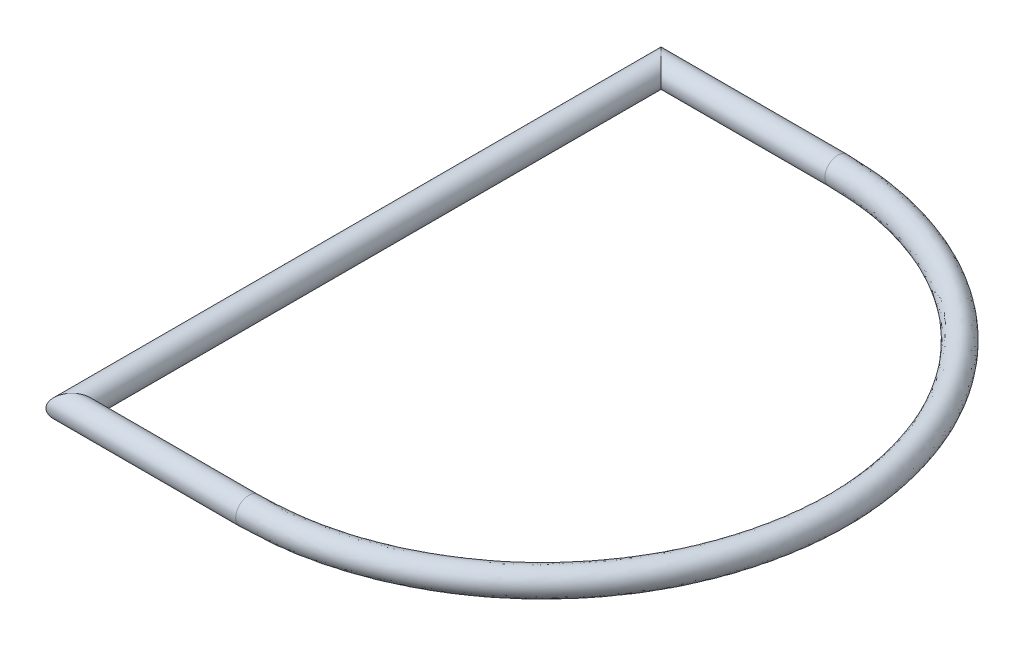
ISO-10303-21;
HEADER;
FILE_DESCRIPTION(('STEP AP214'),'2;1');
FILE_NAME('part.step','',(''),(''),'','','');
FILE_SCHEMA(('AUTOMOTIVE_DESIGN { 1 0 10303 214 1 1 1 1 }'));
ENDSEC;
DATA;
#1=APPLICATION_CONTEXT('core data for automotive mechanical design processes');
#2=APPLICATION_PROTOCOL_DEFINITION('international standard','automotive_design',2000,#1);
#3=PRODUCT_CONTEXT('',#1,'mechanical');
#4=PRODUCT('Part','Part','',(#3));
#5=PRODUCT_RELATED_PRODUCT_CATEGORY('part','',(#4));
#6=PRODUCT_DEFINITION_FORMATION('','',#4);
#7=PRODUCT_DEFINITION_CONTEXT('part definition',#1,'design');
#8=PRODUCT_DEFINITION('design','',#6,#7);
#9=PRODUCT_DEFINITION_SHAPE('','',#8);
#10=(LENGTH_UNIT() NAMED_UNIT(*) SI_UNIT(.MILLI.,.METRE.));
#11=(NAMED_UNIT(*) PLANE_ANGLE_UNIT() SI_UNIT($,.RADIAN.));
#12=(NAMED_UNIT(*) SI_UNIT($,.STERADIAN.) SOLID_ANGLE_UNIT());
#13=UNCERTAINTY_MEASURE_WITH_UNIT(LENGTH_MEASURE(1.E-05),#10,'distance_accuracy_value','');
#14=(GEOMETRIC_REPRESENTATION_CONTEXT(3) GLOBAL_UNCERTAINTY_ASSIGNED_CONTEXT((#13)) GLOBAL_UNIT_ASSIGNED_CONTEXT((#10,
#11,#12)) REPRESENTATION_CONTEXT('',''));
#15=CARTESIAN_POINT('',(0.,0.,0.));
#16=DIRECTION('',(0.,0.,1.));
#17=DIRECTION('',(1.,0.,0.));
#18=AXIS2_PLACEMENT_3D('',#15,#16,#17);
#19=CARTESIAN_POINT('',(0.,0.,-13.0517427730953));
#20=CARTESIAN_POINT('',(0.579660819813724,0.,-13.0296161322367));
#21=CARTESIAN_POINT('',(1.8142200585183,0.,-12.9824909032065));
#22=CARTESIAN_POINT('',(3.75106764393843,0.,-12.5553704856439));
#23=CARTESIAN_POINT('',(5.8291454221124,0.,-11.7581310971385));
#24=CARTESIAN_POINT('',(7.79275026697985,0.,-10.5571059298187));
#25=CARTESIAN_POINT('',(9.53264609347826,0.,-9.0047109175893));
#26=CARTESIAN_POINT('',(10.9815373041297,0.,-7.18821796835268));
#27=CARTESIAN_POINT('',(12.1344228285057,0.,-5.01672025087689));
#28=CARTESIAN_POINT('',(12.8717880115216,0.,-2.58416208948237));
#29=CARTESIAN_POINT('',(13.1425535713877,0.,0.));
#30=CARTESIAN_POINT('',(12.8717880115216,0.,2.5841620894824));
#31=CARTESIAN_POINT('',(12.1344228285057,0.,5.01672025087689));
#32=CARTESIAN_POINT('',(10.9815373041297,0.,7.18821796835269));
#33=CARTESIAN_POINT('',(9.53264609347826,0.,9.00471091758929));
#34=CARTESIAN_POINT('',(7.79275026697981,0.,10.5571059298188));
#35=CARTESIAN_POINT('',(5.8291454221124,0.,11.7581310971385));
#36=CARTESIAN_POINT('',(3.75106764393843,0.,12.5553704856439));
#37=CARTESIAN_POINT('',(1.81422005851829,0.,12.9824909032065));
#38=CARTESIAN_POINT('',(0.57966081981372,0.,13.0296161322367));
#39=CARTESIAN_POINT('',(0.,0.,13.0517427730953));
#40=CARTESIAN_POINT('',(0.,1.10348554619066,-13.0517427730953));
#41=CARTESIAN_POINT('',(0.579660819813724,1.10348554619066,-13.0296161322367));
#42=CARTESIAN_POINT('',(1.8142200585183,1.10348554619066,-12.9824909032065));
#43=CARTESIAN_POINT('',(3.75106764393843,1.10348554619066,-12.5553704856439));
#44=CARTESIAN_POINT('',(5.8291454221124,1.10348554619066,-11.7581310971385));
#45=CARTESIAN_POINT('',(7.79275026697985,1.10348554619066,-10.5571059298187));
#46=CARTESIAN_POINT('',(9.53264609347826,1.10348554619066,-9.0047109175893));
#47=CARTESIAN_POINT('',(10.9815373041297,1.10348554619066,-7.18821796835268));
#48=CARTESIAN_POINT('',(12.1344228285057,1.10348554619066,-5.01672025087689));
#49=CARTESIAN_POINT('',(12.8717880115216,1.10348554619066,-2.58416208948237));
#50=CARTESIAN_POINT('',(13.1425535713877,1.10348554619066,0.));
#51=CARTESIAN_POINT('',(12.8717880115216,1.10348554619066,2.5841620894824));
#52=CARTESIAN_POINT('',(12.1344228285057,1.10348554619066,5.01672025087689));
#53=CARTESIAN_POINT('',(10.9815373041297,1.10348554619066,7.18821796835269));
#54=CARTESIAN_POINT('',(9.53264609347825,1.10348554619066,9.0047109175893));
#55=CARTESIAN_POINT('',(7.79275026697981,1.10348554619066,10.5571059298188));
#56=CARTESIAN_POINT('',(5.8291454221124,1.10348554619066,11.7581310971385));
#57=CARTESIAN_POINT('',(3.75106764393843,1.10348554619066,12.5553704856439));
#58=CARTESIAN_POINT('',(1.81422005851829,1.10348554619066,12.9824909032065));
#59=CARTESIAN_POINT('',(0.57966081981372,1.10348554619066,13.0296161322367));
#60=CARTESIAN_POINT('',(0.,1.10348554619066,13.0517427730953));
#61=CARTESIAN_POINT('',(0.,1.10348554619066,-11.9482572269047));
#62=CARTESIAN_POINT('',(0.53069960438273,1.10348554619066,-11.9280300585203));
#63=CARTESIAN_POINT('',(1.66098144709569,1.10348554619066,-11.8849503181822));
#64=CARTESIAN_POINT('',(3.43385639334133,1.10348554619066,-11.4938164579652));
#65=CARTESIAN_POINT('',(5.33642993741903,1.10348554619066,-10.7640562698605));
#66=CARTESIAN_POINT('',(7.1342158004503,1.10348554619066,-9.66418471073763));
#67=CARTESIAN_POINT('',(8.72547558777085,1.10348554619066,-8.24458503304859));
#68=CARTESIAN_POINT('',(10.0548596057948,1.10348554619066,-6.57736113181003));
#69=CARTESIAN_POINT('',(11.1059529028818,1.10348554619066,-4.59821895149239));
#70=CARTESIAN_POINT('',(11.7840714752216,1.10348554619066,-2.36194905499699));
#71=CARTESIAN_POINT('',(12.031110489848,1.10348554619066,0.));
#72=CARTESIAN_POINT('',(11.7840714752216,1.10348554619066,2.36194905499697));
#73=CARTESIAN_POINT('',(11.1059529028818,1.10348554619066,4.5982189514924));
#74=CARTESIAN_POINT('',(10.0548596057948,1.10348554619066,6.57736113181002));
#75=CARTESIAN_POINT('',(8.72547558777082,1.10348554619066,8.24458503304861));
#76=CARTESIAN_POINT('',(7.13421580045035,1.10348554619066,9.66418471073759));
#77=CARTESIAN_POINT('',(5.33642993741902,1.10348554619066,10.7640562698605));
#78=CARTESIAN_POINT('',(3.43385639334134,1.10348554619066,11.4938164579652));
#79=CARTESIAN_POINT('',(1.66098144709569,1.10348554619066,11.8849503181822));
#80=CARTESIAN_POINT('',(0.530699604382729,1.10348554619066,11.9280300585203));
#81=CARTESIAN_POINT('',(0.,1.10348554619066,11.9482572269047));
#82=CARTESIAN_POINT('',(0.,0.,-11.9482572269047));
#83=CARTESIAN_POINT('',(0.53069960438273,0.,-11.9280300585203));
#84=CARTESIAN_POINT('',(1.66098144709569,0.,-11.8849503181822));
#85=CARTESIAN_POINT('',(3.43385639334133,0.,-11.4938164579652));
#86=CARTESIAN_POINT('',(5.33642993741903,0.,-10.7640562698605));
#87=CARTESIAN_POINT('',(7.1342158004503,0.,-9.66418471073763));
#88=CARTESIAN_POINT('',(8.72547558777085,0.,-8.2445850330486));
#89=CARTESIAN_POINT('',(10.0548596057948,0.,-6.57736113181003));
#90=CARTESIAN_POINT('',(11.1059529028818,0.,-4.59821895149239));
#91=CARTESIAN_POINT('',(11.7840714752216,0.,-2.36194905499699));
#92=CARTESIAN_POINT('',(12.031110489848,0.,0.));
#93=CARTESIAN_POINT('',(11.7840714752216,0.,2.36194905499697));
#94=CARTESIAN_POINT('',(11.1059529028818,0.,4.5982189514924));
#95=CARTESIAN_POINT('',(10.0548596057948,0.,6.57736113181002));
#96=CARTESIAN_POINT('',(8.72547558777082,0.,8.24458503304861));
#97=CARTESIAN_POINT('',(7.13421580045035,0.,9.66418471073759));
#98=CARTESIAN_POINT('',(5.33642993741902,0.,10.7640562698605));
#99=CARTESIAN_POINT('',(3.43385639334134,0.,11.4938164579652));
#100=CARTESIAN_POINT('',(1.66098144709569,0.,11.8849503181822));
#101=CARTESIAN_POINT('',(0.530699604382729,0.,11.9280300585203));
#102=CARTESIAN_POINT('',(0.,0.,11.9482572269047));
#103=CARTESIAN_POINT('',(0.,-1.10348554619066,-11.9482572269047));
#104=CARTESIAN_POINT('',(0.53069960438273,-1.10348554619066,-11.9280300585203));
#105=CARTESIAN_POINT('',(1.66098144709569,-1.10348554619066,-11.8849503181822));
#106=CARTESIAN_POINT('',(3.43385639334133,-1.10348554619066,-11.4938164579652));
#107=CARTESIAN_POINT('',(5.33642993741903,-1.10348554619066,-10.7640562698605));
#108=CARTESIAN_POINT('',(7.1342158004503,-1.10348554619066,-9.66418471073763));
#109=CARTESIAN_POINT('',(8.72547558777085,-1.10348554619066,-8.24458503304859));
#110=CARTESIAN_POINT('',(10.0548596057948,-1.10348554619066,-6.57736113181003));
#111=CARTESIAN_POINT('',(11.1059529028818,-1.10348554619066,-4.59821895149239));
#112=CARTESIAN_POINT('',(11.7840714752216,-1.10348554619066,-2.36194905499699));
#113=CARTESIAN_POINT('',(12.031110489848,-1.10348554619066,0.));
#114=CARTESIAN_POINT('',(11.7840714752216,-1.10348554619066,2.36194905499697));
#115=CARTESIAN_POINT('',(11.1059529028818,-1.10348554619066,4.5982189514924));
#116=CARTESIAN_POINT('',(10.0548596057948,-1.10348554619066,6.57736113181002));
#117=CARTESIAN_POINT('',(8.72547558777082,-1.10348554619066,8.24458503304861));
#118=CARTESIAN_POINT('',(7.13421580045035,-1.10348554619066,9.66418471073759));
#119=CARTESIAN_POINT('',(5.33642993741902,-1.10348554619066,10.7640562698605));
#120=CARTESIAN_POINT('',(3.43385639334134,-1.10348554619066,11.4938164579652));
#121=CARTESIAN_POINT('',(1.66098144709569,-1.10348554619066,11.8849503181822));
#122=CARTESIAN_POINT('',(0.530699604382729,-1.10348554619066,11.9280300585203));
#123=CARTESIAN_POINT('',(0.,-1.10348554619066,11.9482572269047));
#124=CARTESIAN_POINT('',(0.,-1.10348554619066,-13.0517427730953));
#125=CARTESIAN_POINT('',(0.579660819813724,-1.10348554619066,-13.0296161322367));
#126=CARTESIAN_POINT('',(1.8142200585183,-1.10348554619066,-12.9824909032065));
#127=CARTESIAN_POINT('',(3.75106764393843,-1.10348554619066,-12.5553704856439));
#128=CARTESIAN_POINT('',(5.8291454221124,-1.10348554619066,-11.7581310971385));
#129=CARTESIAN_POINT('',(7.79275026697985,-1.10348554619066,-10.5571059298187));
#130=CARTESIAN_POINT('',(9.53264609347826,-1.10348554619066,-9.0047109175893));
#131=CARTESIAN_POINT('',(10.9815373041297,-1.10348554619066,-7.18821796835268));
#132=CARTESIAN_POINT('',(12.1344228285057,-1.10348554619066,-5.01672025087689));
#133=CARTESIAN_POINT('',(12.8717880115216,-1.10348554619066,-2.58416208948237));
#134=CARTESIAN_POINT('',(13.1425535713877,-1.10348554619066,0.));
#135=CARTESIAN_POINT('',(12.8717880115216,-1.10348554619066,2.5841620894824));
#136=CARTESIAN_POINT('',(12.1344228285057,-1.10348554619066,5.01672025087689));
#137=CARTESIAN_POINT('',(10.9815373041297,-1.10348554619066,7.18821796835269));
#138=CARTESIAN_POINT('',(9.53264609347825,-1.10348554619066,9.0047109175893));
#139=CARTESIAN_POINT('',(7.79275026697981,-1.10348554619066,10.5571059298188));
#140=CARTESIAN_POINT('',(5.8291454221124,-1.10348554619066,11.7581310971385));
#141=CARTESIAN_POINT('',(3.75106764393843,-1.10348554619066,12.5553704856439));
#142=CARTESIAN_POINT('',(1.81422005851829,-1.10348554619066,12.9824909032065));
#143=CARTESIAN_POINT('',(0.57966081981372,-1.10348554619066,13.0296161322367));
#144=CARTESIAN_POINT('',(0.,-1.10348554619066,13.0517427730953));
#145=CARTESIAN_POINT('',(0.,0.,-13.0517427730953));
#146=CARTESIAN_POINT('',(0.579660819813724,0.,-13.0296161322367));
#147=CARTESIAN_POINT('',(1.8142200585183,0.,-12.9824909032065));
#148=CARTESIAN_POINT('',(3.75106764393843,0.,-12.5553704856439));
#149=CARTESIAN_POINT('',(5.8291454221124,0.,-11.7581310971385));
#150=CARTESIAN_POINT('',(7.79275026697985,0.,-10.5571059298187));
#151=CARTESIAN_POINT('',(9.53264609347826,0.,-9.0047109175893));
#152=CARTESIAN_POINT('',(10.9815373041297,0.,-7.18821796835268));
#153=CARTESIAN_POINT('',(12.1344228285057,0.,-5.01672025087689));
#154=CARTESIAN_POINT('',(12.8717880115216,0.,-2.58416208948237));
#155=CARTESIAN_POINT('',(13.1425535713877,0.,0.));
#156=CARTESIAN_POINT('',(12.8717880115216,0.,2.5841620894824));
#157=CARTESIAN_POINT('',(12.1344228285057,0.,5.01672025087689));
#158=CARTESIAN_POINT('',(10.9815373041297,0.,7.18821796835269));
#159=CARTESIAN_POINT('',(9.53264609347826,0.,9.00471091758929));
#160=CARTESIAN_POINT('',(7.79275026697981,0.,10.5571059298188));
#161=CARTESIAN_POINT('',(5.8291454221124,0.,11.7581310971385));
#162=CARTESIAN_POINT('',(3.75106764393843,0.,12.5553704856439));
#163=CARTESIAN_POINT('',(1.81422005851829,0.,12.9824909032065));
#164=CARTESIAN_POINT('',(0.57966081981372,0.,13.0296161322367));
#165=CARTESIAN_POINT('',(0.,0.,13.0517427730953));
#166=(BOUNDED_SURFACE() B_SPLINE_SURFACE(3,3,((#19,#20,#21,#22,#23,#24,#25,#26,#27,#28,#29,#30,
#31,#32,#33,#34,#35,#36,#37,#38,#39),(#40,#41,#42,#43,#44,#45,#46,#47,#48,#49,#50,#51,#52,#53,
#54,#55,#56,#57,#58,#59,#60),(#61,#62,#63,#64,#65,#66,#67,#68,#69,#70,#71,#72,#73,#74,#75,#76,
#77,#78,#79,#80,#81),(#82,#83,#84,#85,#86,#87,#88,#89,#90,#91,#92,#93,#94,#95,#96,#97,#98,#99,
#100,#101,#102),(#103,#104,#105,#106,#107,#108,#109,#110,#111,#112,#113,#114,#115,#116,#117,
#118,#119,#120,#121,#122,#123),(#124,#125,#126,#127,#128,#129,#130,#131,#132,#133,#134,#135,
#136,#137,#138,#139,#140,#141,#142,#143,#144),(#145,#146,#147,#148,#149,#150,#151,#152,#153,
#154,#155,#156,#157,#158,#159,#160,#161,#162,#163,#164,#165)),.UNSPECIFIED.,.T.,.F.,
.F.) B_SPLINE_SURFACE_WITH_KNOTS((4,3,4),(4,1,1,1,1,1,1,1,1,1,1,1,1,1,1,1,1,1,4),(0.,0.5,1.),
(0.,0.042439691281211,0.0903878805813134,0.144516546368772,0.204892664798953,0.257918411190372,
0.314559958838195,0.374413268409365,0.436625009247128,0.5,0.563374990752872,0.625586731590635,
0.685440041161805,0.742081588809628,0.795107335201047,0.855483453631228,0.909612119418687,
0.957560308718789,1.),
.UNSPECIFIED.) GEOMETRIC_REPRESENTATION_ITEM() RATIONAL_B_SPLINE_SURFACE(((1.,1.,1.,1.,1.,1.,1.,
1.,1.,1.,1.,1.,1.,1.,1.,1.,1.,1.,1.,1.,1.),(0.333333333333333,0.333333333333333,
0.333333333333333,0.333333333333333,0.333333333333333,0.333333333333333,0.333333333333334,
0.333333333333333,0.333333333333333,0.333333333333333,0.333333333333333,0.333333333333333,
0.333333333333333,0.333333333333333,0.333333333333333,0.333333333333333,0.333333333333333,
0.333333333333333,0.333333333333333,0.333333333333333,0.333333333333333),(0.333333333333333,
0.333333333333333,0.333333333333333,0.333333333333333,0.333333333333333,0.333333333333333,
0.333333333333334,0.333333333333333,0.333333333333333,0.333333333333333,0.333333333333333,
0.333333333333333,0.333333333333333,0.333333333333333,0.333333333333333,0.333333333333333,
0.333333333333333,0.333333333333333,0.333333333333333,0.333333333333333,0.333333333333333),(1.,
1.,1.,1.,1.,1.,1.,1.,1.,1.,1.,1.,1.,1.,1.,1.,1.,1.,1.,1.,1.),(0.333333333333333,
0.333333333333333,0.333333333333333,0.333333333333333,0.333333333333333,0.333333333333333,
0.333333333333334,0.333333333333333,0.333333333333333,0.333333333333333,0.333333333333333,
0.333333333333333,0.333333333333333,0.333333333333333,0.333333333333333,0.333333333333333,
0.333333333333333,0.333333333333333,0.333333333333333,0.333333333333333,0.333333333333333),
(0.333333333333333,0.333333333333333,0.333333333333333,0.333333333333333,0.333333333333333,
0.333333333333333,0.333333333333334,0.333333333333333,0.333333333333333,0.333333333333333,
0.333333333333333,0.333333333333333,0.333333333333333,0.333333333333333,0.333333333333333,
0.333333333333333,0.333333333333333,0.333333333333333,0.333333333333333,0.333333333333333,
0.333333333333333),(1.,1.,1.,1.,1.,1.,1.,1.,1.,1.,1.,1.,1.,1.,1.,1.,1.,1.,1.,1.,1.))) REPRESENTATION_ITEM('') SURFACE());
#167=CARTESIAN_POINT('',(0.,0.,-12.5));
#168=DIRECTION('',(1.,0.,0.));
#169=DIRECTION('',(0.,0.,-1.));
#170=AXIS2_PLACEMENT_3D('',#167,#168,#169);
#171=CIRCLE('',#170,0.551742773095328);
#172=CARTESIAN_POINT('',(0.,0.,-13.0517427730953));
#173=VERTEX_POINT('',#172);
#174=CARTESIAN_POINT('',(0.,0.551742773095328,-12.5));
#175=VERTEX_POINT('',#174);
#176=EDGE_CURVE('E12',#173,#175,#171,.T.);
#177=CARTESIAN_POINT('',(0.,0.,-11.9482572269047));
#178=VERTEX_POINT('',#177);
#179=EDGE_CURVE('E48',#175,#178,#171,.T.);
#180=CARTESIAN_POINT('',(0.,-0.551742773095328,-12.5));
#181=VERTEX_POINT('',#180);
#182=EDGE_CURVE('E66',#178,#181,#171,.T.);
#183=EDGE_CURVE('E49',#181,#173,#171,.T.);
#184=CARTESIAN_POINT('',(0.,0.,12.5));
#185=DIRECTION('',(1.,0.,0.));
#186=DIRECTION('',(0.,0.,-1.));
#187=AXIS2_PLACEMENT_3D('',#184,#185,#186);
#188=CIRCLE('',#187,0.551742773095328);
#189=CARTESIAN_POINT('',(0.,0.,11.9482572269047));
#190=VERTEX_POINT('',#189);
#191=EDGE_CURVE('E67',#190,#190,#188,.T.);
#192=ORIENTED_EDGE('',*,*,#176,.T.);
#193=ORIENTED_EDGE('',*,*,#179,.T.);
#194=ORIENTED_EDGE('',*,*,#182,.T.);
#195=ORIENTED_EDGE('',*,*,#183,.T.);
#196=EDGE_LOOP('',(#192,#193,#194,#195));
#197=FACE_BOUND('',#196,.T.);
#198=ORIENTED_EDGE('',*,*,#191,.T.);
#199=EDGE_LOOP('',(#198));
#200=FACE_BOUND('',#199,.T.);
#201=ADVANCED_FACE('F39',(#197,#200),#166,.T.);
#202=CARTESIAN_POINT('',(0.,0.,11.9482572269047));
#203=CARTESIAN_POINT('',(-6.94825722690467,0.,11.9482572269047));
#204=CARTESIAN_POINT('',(0.,1.10348554619066,11.9482572269047));
#205=CARTESIAN_POINT('',(-6.94825722690467,1.10348554619066,11.9482572269047));
#206=CARTESIAN_POINT('',(0.,1.10348554619066,13.0517427730953));
#207=CARTESIAN_POINT('',(-8.05174277309532,1.10348554619066,13.0517427730953));
#208=CARTESIAN_POINT('',(0.,0.,13.0517427730953));
#209=CARTESIAN_POINT('',(-8.05174277309532,0.,13.0517427730953));
#210=CARTESIAN_POINT('',(0.,-1.10348554619066,13.0517427730953));
#211=CARTESIAN_POINT('',(-8.05174277309532,-1.10348554619066,13.0517427730953));
#212=CARTESIAN_POINT('',(0.,-1.10348554619066,11.9482572269047));
#213=CARTESIAN_POINT('',(-6.94825722690467,-1.10348554619066,11.9482572269047));
#214=CARTESIAN_POINT('',(0.,0.,11.9482572269047));
#215=CARTESIAN_POINT('',(-6.94825722690467,0.,11.9482572269047));
#216=(BOUNDED_SURFACE() B_SPLINE_SURFACE(3,1,((#202,#203),(#204,#205),(#206,#207),(#208,#209),
(#210,#211),(#212,#213),(#214,#215)),.UNSPECIFIED.,.T.,.F.,.F.) B_SPLINE_SURFACE_WITH_KNOTS((4,
3,4),(2,2),(0.,0.5,1.),(0.,1.),
.UNSPECIFIED.) GEOMETRIC_REPRESENTATION_ITEM() RATIONAL_B_SPLINE_SURFACE(((1.,1.),
(0.333333333333333,0.333333333333333),(0.333333333333333,0.333333333333333),(1.,1.),
(0.333333333333333,0.333333333333333),(0.333333333333333,0.333333333333333),(1.,1.))) REPRESENTATION_ITEM('') SURFACE());
#217=CARTESIAN_POINT('',(-6.94825722690467,0.,11.9482572269047));
#218=CARTESIAN_POINT('',(-6.94825722690467,1.10348554619066,11.9482572269047));
#219=CARTESIAN_POINT('',(-8.05174277309532,1.10348554619066,13.0517427730953));
#220=CARTESIAN_POINT('',(-8.05174277309532,0.,13.0517427730953));
#221=CARTESIAN_POINT('',(-8.05174277309532,-1.10348554619066,13.0517427730953));
#222=CARTESIAN_POINT('',(-6.94825722690467,-1.10348554619066,11.9482572269047));
#223=CARTESIAN_POINT('',(-6.94825722690467,0.,11.9482572269047));
#224=(BOUNDED_CURVE() B_SPLINE_CURVE(3,(#217,#218,#219,#220,#221,#222,#223),.UNSPECIFIED.,.T.,
.F.) B_SPLINE_CURVE_WITH_KNOTS((4,3,4),(0.,0.5,1.),
.UNSPECIFIED.) CURVE() GEOMETRIC_REPRESENTATION_ITEM() RATIONAL_B_SPLINE_CURVE((1.,
0.333333333333333,0.333333333333333,1.,0.333333333333333,0.333333333333333,1.)) REPRESENTATION_ITEM(''));
#225=CARTESIAN_POINT('',(-6.94825722690467,0.,11.9482572269047));
#226=VERTEX_POINT('',#225);
#227=EDGE_CURVE('E69',#226,#226,#224,.F.);
#228=ORIENTED_EDGE('',*,*,#191,.F.);
#229=EDGE_LOOP('',(#228));
#230=FACE_BOUND('',#229,.T.);
#231=ORIENTED_EDGE('',*,*,#227,.F.);
#232=EDGE_LOOP('',(#231));
#233=FACE_BOUND('',#232,.T.);
#234=ADVANCED_FACE('F95',(#230,#233),#216,.F.);
#235=CARTESIAN_POINT('',(-6.94825722690467,0.,11.9482572269047));
#236=CARTESIAN_POINT('',(-6.94825722690467,0.,-11.9482572269047));
#237=CARTESIAN_POINT('',(-6.94825722690467,-1.10348554619066,11.9482572269047));
#238=CARTESIAN_POINT('',(-6.94825722690467,-1.10348554619066,-11.9482572269047));
#239=CARTESIAN_POINT('',(-8.05174277309532,-1.10348554619066,13.0517427730953));
#240=CARTESIAN_POINT('',(-8.05174277309533,-1.10348554619066,-13.0517427730953));
#241=CARTESIAN_POINT('',(-8.05174277309532,0.,13.0517427730953));
#242=CARTESIAN_POINT('',(-8.05174277309533,0.,-13.0517427730953));
#243=CARTESIAN_POINT('',(-8.05174277309532,1.10348554619066,13.0517427730953));
#244=CARTESIAN_POINT('',(-8.05174277309533,1.10348554619066,-13.0517427730953));
#245=CARTESIAN_POINT('',(-6.94825722690467,1.10348554619066,11.9482572269047));
#246=CARTESIAN_POINT('',(-6.94825722690467,1.10348554619066,-11.9482572269047));
#247=CARTESIAN_POINT('',(-6.94825722690467,0.,11.9482572269047));
#248=CARTESIAN_POINT('',(-6.94825722690467,0.,-11.9482572269047));
#249=(BOUNDED_SURFACE() B_SPLINE_SURFACE(3,1,((#235,#236),(#237,#238),(#239,#240),(#241,#242),
(#243,#244),(#245,#246),(#247,#248)),.UNSPECIFIED.,.T.,.F.,.F.) B_SPLINE_SURFACE_WITH_KNOTS((4,
3,4),(2,2),(0.,0.5,1.),(0.,1.),
.UNSPECIFIED.) GEOMETRIC_REPRESENTATION_ITEM() RATIONAL_B_SPLINE_SURFACE(((1.,1.),
(0.333333333333333,0.333333333333333),(0.333333333333333,0.333333333333333),(1.,1.),
(0.333333333333333,0.333333333333333),(0.333333333333333,0.333333333333333),(1.,1.))) REPRESENTATION_ITEM('') SURFACE());
#250=CARTESIAN_POINT('',(-6.94825722690467,0.,-11.9482572269047));
#251=CARTESIAN_POINT('',(-6.94825722690467,1.10348554619066,-11.9482572269047));
#252=CARTESIAN_POINT('',(-8.05174277309533,1.10348554619066,-13.0517427730953));
#253=CARTESIAN_POINT('',(-8.05174277309533,0.,-13.0517427730953));
#254=CARTESIAN_POINT('',(-8.05174277309533,-1.10348554619066,-13.0517427730953));
#255=CARTESIAN_POINT('',(-6.94825722690467,-1.10348554619066,-11.9482572269047));
#256=CARTESIAN_POINT('',(-6.94825722690467,0.,-11.9482572269047));
#257=(BOUNDED_CURVE() B_SPLINE_CURVE(3,(#250,#251,#252,#253,#254,#255,#256),.UNSPECIFIED.,.T.,
.F.) B_SPLINE_CURVE_WITH_KNOTS((4,3,4),(0.,0.5,1.),
.UNSPECIFIED.) CURVE() GEOMETRIC_REPRESENTATION_ITEM() RATIONAL_B_SPLINE_CURVE((1.,
0.333333333333333,0.333333333333333,1.,0.333333333333333,0.333333333333333,1.)) REPRESENTATION_ITEM(''));
#258=CARTESIAN_POINT('',(-6.94825722690467,0.,-11.9482572269047));
#259=VERTEX_POINT('',#258);
#260=EDGE_CURVE('E72',#259,#259,#257,.T.);
#261=ORIENTED_EDGE('',*,*,#227,.T.);
#262=EDGE_LOOP('',(#261));
#263=FACE_BOUND('',#262,.T.);
#264=ORIENTED_EDGE('',*,*,#260,.T.);
#265=EDGE_LOOP('',(#264));
#266=FACE_BOUND('',#265,.T.);
#267=ADVANCED_FACE('F88',(#263,#266),#249,.T.);
#268=CARTESIAN_POINT('',(-6.94825722690467,0.,-11.9482572269047));
#269=CARTESIAN_POINT('',(0.,0.,-11.9482572269047));
#270=CARTESIAN_POINT('',(-6.94825722690467,1.10348554619066,-11.9482572269047));
#271=CARTESIAN_POINT('',(0.,1.10348554619066,-11.9482572269047));
#272=CARTESIAN_POINT('',(-8.05174277309533,1.10348554619066,-13.0517427730953));
#273=CARTESIAN_POINT('',(0.,1.10348554619066,-13.0517427730953));
#274=CARTESIAN_POINT('',(-8.05174277309533,0.,-13.0517427730953));
#275=CARTESIAN_POINT('',(0.,0.,-13.0517427730953));
#276=CARTESIAN_POINT('',(-8.05174277309533,-1.10348554619066,-13.0517427730953));
#277=CARTESIAN_POINT('',(0.,-1.10348554619066,-13.0517427730953));
#278=CARTESIAN_POINT('',(-6.94825722690467,-1.10348554619066,-11.9482572269047));
#279=CARTESIAN_POINT('',(0.,-1.10348554619066,-11.9482572269047));
#280=CARTESIAN_POINT('',(-6.94825722690467,0.,-11.9482572269047));
#281=CARTESIAN_POINT('',(0.,0.,-11.9482572269047));
#282=(BOUNDED_SURFACE() B_SPLINE_SURFACE(3,1,((#268,#269),(#270,#271),(#272,#273),(#274,#275),
(#276,#277),(#278,#279),(#280,#281)),.UNSPECIFIED.,.T.,.F.,.F.) B_SPLINE_SURFACE_WITH_KNOTS((4,
3,4),(2,2),(0.,0.5,1.),(0.,1.),
.UNSPECIFIED.) GEOMETRIC_REPRESENTATION_ITEM() RATIONAL_B_SPLINE_SURFACE(((1.,1.),
(0.333333333333333,0.333333333333333),(0.333333333333333,0.333333333333333),(1.,1.),
(0.333333333333333,0.333333333333333),(0.333333333333333,0.333333333333333),(1.,1.))) REPRESENTATION_ITEM('') SURFACE());
#283=ORIENTED_EDGE('',*,*,#260,.F.);
#284=EDGE_LOOP('',(#283));
#285=FACE_BOUND('',#284,.T.);
#286=ORIENTED_EDGE('',*,*,#176,.F.);
#287=ORIENTED_EDGE('',*,*,#183,.F.);
#288=ORIENTED_EDGE('',*,*,#182,.F.);
#289=ORIENTED_EDGE('',*,*,#179,.F.);
#290=EDGE_LOOP('',(#286,#287,#288,#289));
#291=FACE_BOUND('',#290,.T.);
#292=ADVANCED_FACE('F63',(#285,#291),#282,.F.);
#293=CLOSED_SHELL('',(#201,#234,#267,#292));
#294=MANIFOLD_SOLID_BREP('B2',#293);
#295=ADVANCED_BREP_SHAPE_REPRESENTATION('',(#18,#294),#14);
#296=SHAPE_DEFINITION_REPRESENTATION(#9,#295);
ENDSEC;
END-ISO-10303-21;
